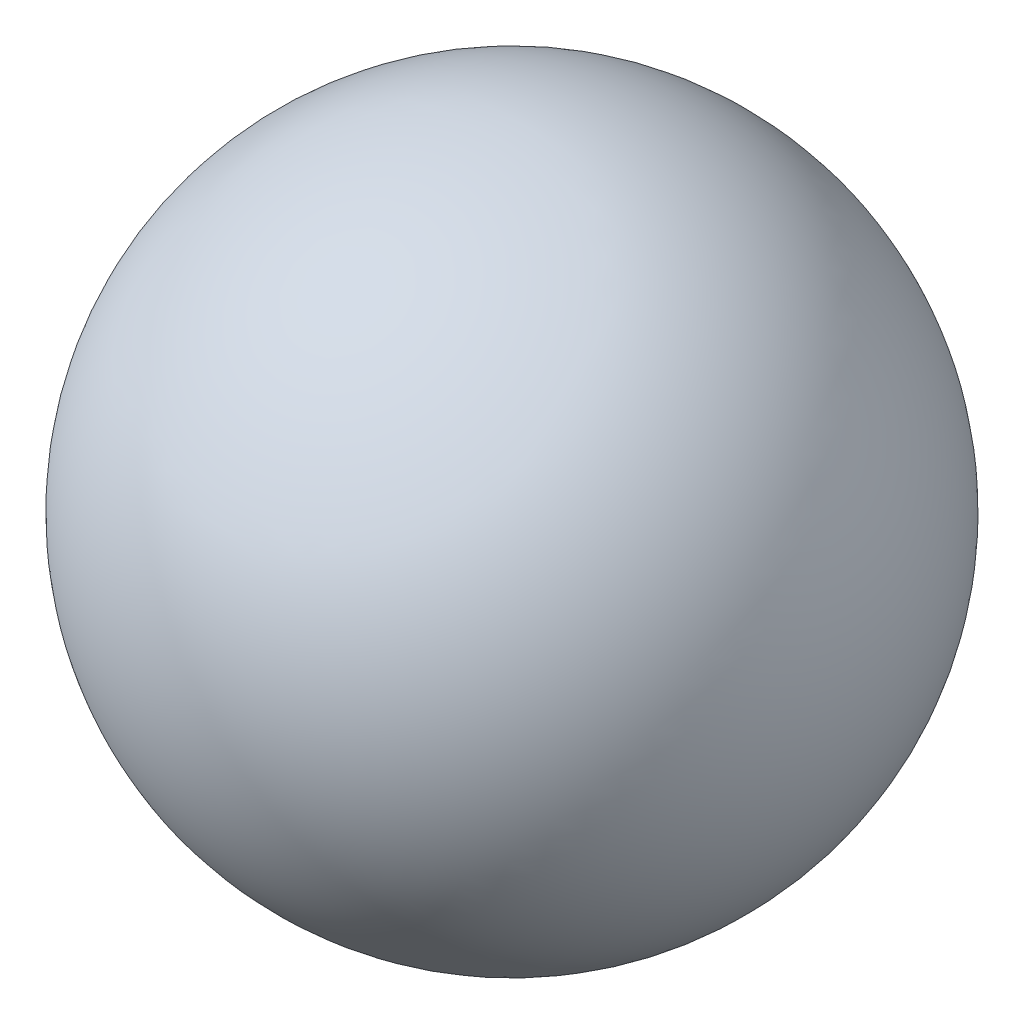
ISO-10303-21;
HEADER;
FILE_DESCRIPTION(('STEP AP214'),'2;1');
FILE_NAME('part.step','',(''),(''),'','','');
FILE_SCHEMA(('AUTOMOTIVE_DESIGN { 1 0 10303 214 1 1 1 1 }'));
ENDSEC;
DATA;
#1=APPLICATION_CONTEXT('core data for automotive mechanical design processes');
#2=APPLICATION_PROTOCOL_DEFINITION('international standard','automotive_design',2000,#1);
#3=PRODUCT_CONTEXT('',#1,'mechanical');
#4=PRODUCT('Part','Part','',(#3));
#5=PRODUCT_RELATED_PRODUCT_CATEGORY('part','',(#4));
#6=PRODUCT_DEFINITION_FORMATION('','',#4);
#7=PRODUCT_DEFINITION_CONTEXT('part definition',#1,'design');
#8=PRODUCT_DEFINITION('design','',#6,#7);
#9=PRODUCT_DEFINITION_SHAPE('','',#8);
#10=(LENGTH_UNIT() NAMED_UNIT(*) SI_UNIT(.MILLI.,.METRE.));
#11=(NAMED_UNIT(*) PLANE_ANGLE_UNIT() SI_UNIT($,.RADIAN.));
#12=(NAMED_UNIT(*) SI_UNIT($,.STERADIAN.) SOLID_ANGLE_UNIT());
#13=UNCERTAINTY_MEASURE_WITH_UNIT(LENGTH_MEASURE(1.E-05),#10,'distance_accuracy_value','');
#14=(GEOMETRIC_REPRESENTATION_CONTEXT(3) GLOBAL_UNCERTAINTY_ASSIGNED_CONTEXT((#13)) GLOBAL_UNIT_ASSIGNED_CONTEXT((#10,
#11,#12)) REPRESENTATION_CONTEXT('',''));
#15=CARTESIAN_POINT('',(0.,0.,0.));
#16=DIRECTION('',(0.,0.,1.));
#17=DIRECTION('',(1.,0.,0.));
#18=AXIS2_PLACEMENT_3D('',#15,#16,#17);
#19=CARTESIAN_POINT('',(0.,0.,0.));
#20=DIRECTION('',(0.,0.,1.));
#21=DIRECTION('',(0.,1.,0.));
#22=AXIS2_PLACEMENT_3D('',#19,#20,#21);
#23=SPHERICAL_SURFACE('',#22,19.);
#24=CARTESIAN_POINT('',(0.,0.,19.));
#25=VERTEX_POINT('',#24);
#26=VERTEX_LOOP('',#25);
#27=FACE_BOUND('',#26,.T.);
#28=ADVANCED_FACE('F29',(#27),#23,.T.);
#29=CLOSED_SHELL('',(#28));
#30=CARTESIAN_POINT('',(0.,0.,0.));
#31=DIRECTION('',(0.,0.,1.));
#32=DIRECTION('',(0.,-1.,0.));
#33=AXIS2_PLACEMENT_3D('',#30,#31,#32);
#34=SPHERICAL_SURFACE('',#33,18.5);
#35=CARTESIAN_POINT('',(0.,0.,18.5));
#36=VERTEX_POINT('',#35);
#37=VERTEX_LOOP('',#36);
#38=FACE_BOUND('',#37,.T.);
#39=ADVANCED_FACE('F42',(#38),#34,.F.);
#40=CLOSED_SHELL('',(#39));
#41=ORIENTED_CLOSED_SHELL('',*,#40,.T.);
#42=BREP_WITH_VOIDS('B2',#29,(#41));
#43=ADVANCED_BREP_SHAPE_REPRESENTATION('',(#18,#42),#14);
#44=SHAPE_DEFINITION_REPRESENTATION(#9,#43);
ENDSEC;
END-ISO-10303-21;
